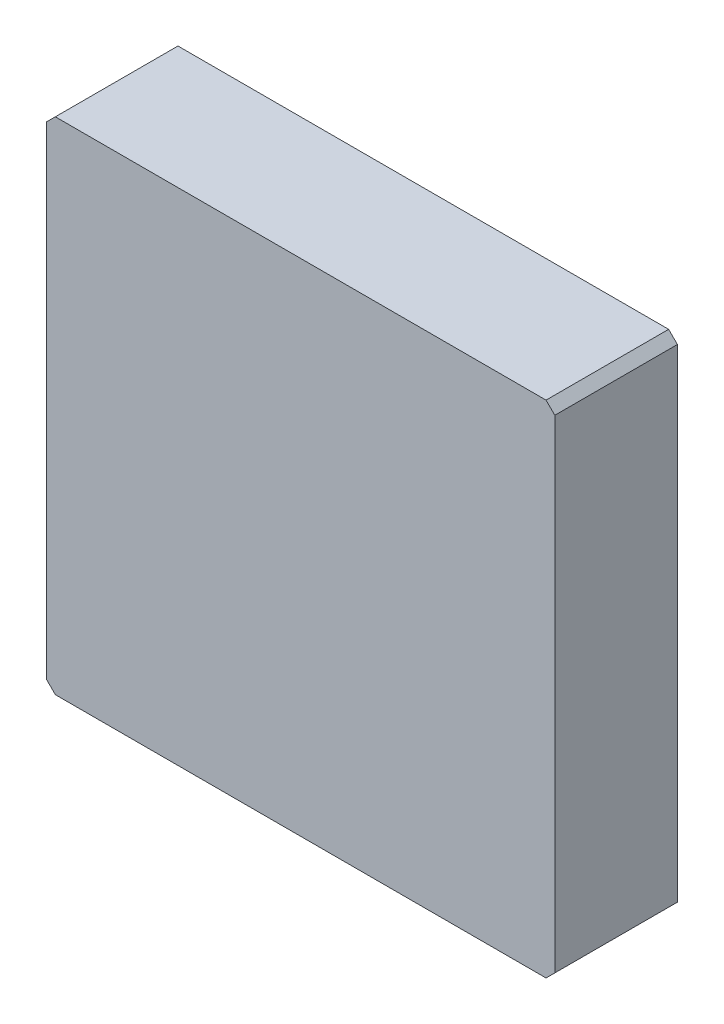
ISO-10303-21;
HEADER;
FILE_DESCRIPTION(('STEP AP214'),'2;1');
FILE_NAME('part.step','',(''),(''),'','','');
FILE_SCHEMA(('AUTOMOTIVE_DESIGN { 1 0 10303 214 1 1 1 1 }'));
ENDSEC;
DATA;
#1=APPLICATION_CONTEXT('core data for automotive mechanical design processes');
#2=APPLICATION_PROTOCOL_DEFINITION('international standard','automotive_design',2000,#1);
#3=PRODUCT_CONTEXT('',#1,'mechanical');
#4=PRODUCT('Part','Part','',(#3));
#5=PRODUCT_RELATED_PRODUCT_CATEGORY('part','',(#4));
#6=PRODUCT_DEFINITION_FORMATION('','',#4);
#7=PRODUCT_DEFINITION_CONTEXT('part definition',#1,'design');
#8=PRODUCT_DEFINITION('design','',#6,#7);
#9=PRODUCT_DEFINITION_SHAPE('','',#8);
#10=(LENGTH_UNIT() NAMED_UNIT(*) SI_UNIT(.MILLI.,.METRE.));
#11=(NAMED_UNIT(*) PLANE_ANGLE_UNIT() SI_UNIT($,.RADIAN.));
#12=(NAMED_UNIT(*) SI_UNIT($,.STERADIAN.) SOLID_ANGLE_UNIT());
#13=UNCERTAINTY_MEASURE_WITH_UNIT(LENGTH_MEASURE(1.E-05),#10,'distance_accuracy_value','');
#14=(GEOMETRIC_REPRESENTATION_CONTEXT(3) GLOBAL_UNCERTAINTY_ASSIGNED_CONTEXT((#13)) GLOBAL_UNIT_ASSIGNED_CONTEXT((#10,
#11,#12)) REPRESENTATION_CONTEXT('',''));
#15=CARTESIAN_POINT('',(0.,0.,0.));
#16=DIRECTION('',(0.,0.,1.));
#17=DIRECTION('',(1.,0.,0.));
#18=AXIS2_PLACEMENT_3D('',#15,#16,#17);
#19=CARTESIAN_POINT('',(0.,3.55599999999999,49.784));
#20=DIRECTION('',(1.,0.,0.));
#21=DIRECTION('',(0.,0.,-1.));
#22=AXIS2_PLACEMENT_3D('',#19,#20,#21);
#23=PLANE('',#22);
#24=DIRECTION('',(0.,-1.,0.));
#25=VECTOR('',#24,1.);
#26=CARTESIAN_POINT('',(0.,3.55599999999999,0.));
#27=LINE('',#26,#25);
#28=CARTESIAN_POINT('',(0.,199.644,0.));
#29=VERTEX_POINT('',#28);
#30=CARTESIAN_POINT('',(0.,3.55599999999999,0.));
#31=VERTEX_POINT('',#30);
#32=EDGE_CURVE('E141',#29,#31,#27,.T.);
#33=ORIENTED_EDGE('',*,*,#32,.T.);
#34=DIRECTION('',(0.,0.,-1.));
#35=VECTOR('',#34,1.);
#36=CARTESIAN_POINT('',(0.,3.55599999999999,49.784));
#37=LINE('',#36,#35);
#38=CARTESIAN_POINT('',(0.,3.55599999999999,49.784));
#39=VERTEX_POINT('',#38);
#40=EDGE_CURVE('E11',#39,#31,#37,.T.);
#41=ORIENTED_EDGE('',*,*,#40,.F.);
#42=DIRECTION('',(0.,-1.,0.));
#43=VECTOR('',#42,1.);
#44=CARTESIAN_POINT('',(0.,3.55599999999999,49.784));
#45=LINE('',#44,#43);
#46=CARTESIAN_POINT('',(0.,199.644,49.784));
#47=VERTEX_POINT('',#46);
#48=EDGE_CURVE('E157',#47,#39,#45,.T.);
#49=ORIENTED_EDGE('',*,*,#48,.F.);
#50=DIRECTION('',(0.,0.,-1.));
#51=VECTOR('',#50,1.);
#52=CARTESIAN_POINT('',(0.,199.644,49.784));
#53=LINE('',#52,#51);
#54=EDGE_CURVE('E137',#47,#29,#53,.T.);
#55=ORIENTED_EDGE('',*,*,#54,.T.);
#56=EDGE_LOOP('',(#33,#41,#49,#55));
#57=FACE_BOUND('',#56,.T.);
#58=ADVANCED_FACE('F33',(#57),#23,.F.);
#59=CARTESIAN_POINT('',(0.,3.55599999999999,49.784));
#60=DIRECTION('',(0.707106781186546,0.707106781186549,0.));
#61=DIRECTION('',(-0.707106781186549,0.707106781186546,0.));
#62=AXIS2_PLACEMENT_3D('',#59,#60,#61);
#63=PLANE('',#62);
#64=DIRECTION('',(0.707106781186549,-0.707106781186546,0.));
#65=VECTOR('',#64,1.);
#66=CARTESIAN_POINT('',(0.,3.55599999999999,0.));
#67=LINE('',#66,#65);
#68=CARTESIAN_POINT('',(3.556,0.,0.));
#69=VERTEX_POINT('',#68);
#70=EDGE_CURVE('E144',#31,#69,#67,.T.);
#71=ORIENTED_EDGE('',*,*,#70,.T.);
#72=DIRECTION('',(0.,0.,-1.));
#73=VECTOR('',#72,1.);
#74=CARTESIAN_POINT('',(3.556,0.,49.784));
#75=LINE('',#74,#73);
#76=CARTESIAN_POINT('',(3.556,0.,49.784));
#77=VERTEX_POINT('',#76);
#78=EDGE_CURVE('E40',#77,#69,#75,.T.);
#79=ORIENTED_EDGE('',*,*,#78,.F.);
#80=DIRECTION('',(0.707106781186549,-0.707106781186546,0.));
#81=VECTOR('',#80,1.);
#82=CARTESIAN_POINT('',(0.,3.55599999999999,49.784));
#83=LINE('',#82,#81);
#84=EDGE_CURVE('E97',#39,#77,#83,.T.);
#85=ORIENTED_EDGE('',*,*,#84,.F.);
#86=ORIENTED_EDGE('',*,*,#40,.T.);
#87=EDGE_LOOP('',(#71,#79,#85,#86));
#88=FACE_BOUND('',#87,.T.);
#89=ADVANCED_FACE('F403',(#88),#63,.F.);
#90=CARTESIAN_POINT('',(3.556,0.,49.784));
#91=DIRECTION('',(0.,1.,0.));
#92=DIRECTION('',(0.,0.,1.));
#93=AXIS2_PLACEMENT_3D('',#90,#91,#92);
#94=PLANE('',#93);
#95=DIRECTION('',(1.,0.,0.));
#96=VECTOR('',#95,1.);
#97=CARTESIAN_POINT('',(3.556,0.,0.));
#98=LINE('',#97,#96);
#99=CARTESIAN_POINT('',(202.7936,0.,0.));
#100=VERTEX_POINT('',#99);
#101=EDGE_CURVE('E147',#69,#100,#98,.T.);
#102=ORIENTED_EDGE('',*,*,#101,.T.);
#103=DIRECTION('',(0.,0.,-1.));
#104=VECTOR('',#103,1.);
#105=CARTESIAN_POINT('',(202.7936,0.,49.784));
#106=LINE('',#105,#104);
#107=CARTESIAN_POINT('',(202.7936,0.,49.784));
#108=VERTEX_POINT('',#107);
#109=EDGE_CURVE('E164',#108,#100,#106,.T.);
#110=ORIENTED_EDGE('',*,*,#109,.F.);
#111=DIRECTION('',(1.,0.,0.));
#112=VECTOR('',#111,1.);
#113=CARTESIAN_POINT('',(3.556,0.,49.784));
#114=LINE('',#113,#112);
#115=EDGE_CURVE('E172',#77,#108,#114,.T.);
#116=ORIENTED_EDGE('',*,*,#115,.F.);
#117=ORIENTED_EDGE('',*,*,#78,.T.);
#118=EDGE_LOOP('',(#102,#110,#116,#117));
#119=FACE_BOUND('',#118,.T.);
#120=ADVANCED_FACE('F170',(#119),#94,.F.);
#121=CARTESIAN_POINT('',(202.7936,0.,49.784));
#122=DIRECTION('',(-0.707106781186546,0.707106781186549,0.));
#123=DIRECTION('',(-0.707106781186549,-0.707106781186546,0.));
#124=AXIS2_PLACEMENT_3D('',#121,#122,#123);
#125=PLANE('',#124);
#126=DIRECTION('',(0.707106781186549,0.707106781186546,0.));
#127=VECTOR('',#126,1.);
#128=CARTESIAN_POINT('',(202.7936,0.,0.));
#129=LINE('',#128,#127);
#130=CARTESIAN_POINT('',(206.3496,3.55599999999999,0.));
#131=VERTEX_POINT('',#130);
#132=EDGE_CURVE('E149',#100,#131,#129,.T.);
#133=ORIENTED_EDGE('',*,*,#132,.T.);
#134=DIRECTION('',(0.,0.,-1.));
#135=VECTOR('',#134,1.);
#136=CARTESIAN_POINT('',(206.3496,3.55599999999999,49.784));
#137=LINE('',#136,#135);
#138=CARTESIAN_POINT('',(206.3496,3.55599999999999,49.784));
#139=VERTEX_POINT('',#138);
#140=EDGE_CURVE('E161',#139,#131,#137,.T.);
#141=ORIENTED_EDGE('',*,*,#140,.F.);
#142=DIRECTION('',(0.707106781186549,0.707106781186546,0.));
#143=VECTOR('',#142,1.);
#144=CARTESIAN_POINT('',(202.7936,0.,49.784));
#145=LINE('',#144,#143);
#146=EDGE_CURVE('E184',#108,#139,#145,.T.);
#147=ORIENTED_EDGE('',*,*,#146,.F.);
#148=ORIENTED_EDGE('',*,*,#109,.T.);
#149=EDGE_LOOP('',(#133,#141,#147,#148));
#150=FACE_BOUND('',#149,.T.);
#151=ADVANCED_FACE('F180',(#150),#125,.F.);
#152=CARTESIAN_POINT('',(206.3496,3.55599999999999,49.784));
#153=DIRECTION('',(-1.,0.,0.));
#154=DIRECTION('',(0.,0.,1.));
#155=AXIS2_PLACEMENT_3D('',#152,#153,#154);
#156=PLANE('',#155);
#157=DIRECTION('',(0.,1.,0.));
#158=VECTOR('',#157,1.);
#159=CARTESIAN_POINT('',(206.3496,3.55599999999999,0.));
#160=LINE('',#159,#158);
#161=CARTESIAN_POINT('',(206.3496,199.644,0.));
#162=VERTEX_POINT('',#161);
#163=EDGE_CURVE('E151',#131,#162,#160,.T.);
#164=ORIENTED_EDGE('',*,*,#163,.T.);
#165=DIRECTION('',(0.,0.,-1.));
#166=VECTOR('',#165,1.);
#167=CARTESIAN_POINT('',(206.3496,199.644,49.784));
#168=LINE('',#167,#166);
#169=CARTESIAN_POINT('',(206.3496,199.644,49.784));
#170=VERTEX_POINT('',#169);
#171=EDGE_CURVE('E132',#170,#162,#168,.T.);
#172=ORIENTED_EDGE('',*,*,#171,.F.);
#173=DIRECTION('',(0.,1.,0.));
#174=VECTOR('',#173,1.);
#175=CARTESIAN_POINT('',(206.3496,3.55599999999999,49.784));
#176=LINE('',#175,#174);
#177=EDGE_CURVE('E120',#139,#170,#176,.T.);
#178=ORIENTED_EDGE('',*,*,#177,.F.);
#179=ORIENTED_EDGE('',*,*,#140,.T.);
#180=EDGE_LOOP('',(#164,#172,#178,#179));
#181=FACE_BOUND('',#180,.T.);
#182=ADVANCED_FACE('F183',(#181),#156,.F.);
#183=CARTESIAN_POINT('',(202.7936,203.2,49.784));
#184=DIRECTION('',(-0.707106781186545,-0.70710678118655,0.));
#185=DIRECTION('',(0.70710678118655,-0.707106781186545,0.));
#186=AXIS2_PLACEMENT_3D('',#183,#184,#185);
#187=PLANE('',#186);
#188=DIRECTION('',(-0.70710678118655,0.707106781186545,0.));
#189=VECTOR('',#188,1.);
#190=CARTESIAN_POINT('',(202.7936,203.2,0.));
#191=LINE('',#190,#189);
#192=CARTESIAN_POINT('',(202.7936,203.2,0.));
#193=VERTEX_POINT('',#192);
#194=EDGE_CURVE('E129',#162,#193,#191,.T.);
#195=ORIENTED_EDGE('',*,*,#194,.T.);
#196=DIRECTION('',(0.,0.,-1.));
#197=VECTOR('',#196,1.);
#198=CARTESIAN_POINT('',(202.7936,203.2,49.784));
#199=LINE('',#198,#197);
#200=CARTESIAN_POINT('',(202.7936,203.2,49.784));
#201=VERTEX_POINT('',#200);
#202=EDGE_CURVE('E126',#201,#193,#199,.T.);
#203=ORIENTED_EDGE('',*,*,#202,.F.);
#204=DIRECTION('',(-0.70710678118655,0.707106781186545,0.));
#205=VECTOR('',#204,1.);
#206=CARTESIAN_POINT('',(202.7936,203.2,49.784));
#207=LINE('',#206,#205);
#208=EDGE_CURVE('E113',#170,#201,#207,.T.);
#209=ORIENTED_EDGE('',*,*,#208,.F.);
#210=ORIENTED_EDGE('',*,*,#171,.T.);
#211=EDGE_LOOP('',(#195,#203,#209,#210));
#212=FACE_BOUND('',#211,.T.);
#213=ADVANCED_FACE('F127',(#212),#187,.F.);
#214=CARTESIAN_POINT('',(3.55599999999999,203.2,49.784));
#215=DIRECTION('',(0.,-1.,0.));
#216=DIRECTION('',(0.,0.,-1.));
#217=AXIS2_PLACEMENT_3D('',#214,#215,#216);
#218=PLANE('',#217);
#219=DIRECTION('',(-1.,0.,0.));
#220=VECTOR('',#219,1.);
#221=CARTESIAN_POINT('',(3.55599999999999,203.2,0.));
#222=LINE('',#221,#220);
#223=CARTESIAN_POINT('',(3.55599999999999,203.2,0.));
#224=VERTEX_POINT('',#223);
#225=EDGE_CURVE('E154',#193,#224,#222,.T.);
#226=ORIENTED_EDGE('',*,*,#225,.T.);
#227=DIRECTION('',(0.,0.,-1.));
#228=VECTOR('',#227,1.);
#229=CARTESIAN_POINT('',(3.55599999999999,203.2,49.784));
#230=LINE('',#229,#228);
#231=CARTESIAN_POINT('',(3.55599999999999,203.2,49.784));
#232=VERTEX_POINT('',#231);
#233=EDGE_CURVE('E133',#232,#224,#230,.T.);
#234=ORIENTED_EDGE('',*,*,#233,.F.);
#235=DIRECTION('',(-1.,0.,0.));
#236=VECTOR('',#235,1.);
#237=CARTESIAN_POINT('',(3.55599999999999,203.2,49.784));
#238=LINE('',#237,#236);
#239=EDGE_CURVE('E117',#201,#232,#238,.T.);
#240=ORIENTED_EDGE('',*,*,#239,.F.);
#241=ORIENTED_EDGE('',*,*,#202,.T.);
#242=EDGE_LOOP('',(#226,#234,#240,#241));
#243=FACE_BOUND('',#242,.T.);
#244=ADVANCED_FACE('F135',(#243),#218,.F.);
#245=CARTESIAN_POINT('',(0.,199.644,49.784));
#246=DIRECTION('',(0.707106781186549,-0.707106781186546,0.));
#247=DIRECTION('',(0.707106781186546,0.707106781186549,0.));
#248=AXIS2_PLACEMENT_3D('',#245,#246,#247);
#249=PLANE('',#248);
#250=DIRECTION('',(-0.707106781186546,-0.707106781186549,0.));
#251=VECTOR('',#250,1.);
#252=CARTESIAN_POINT('',(0.,199.644,0.));
#253=LINE('',#252,#251);
#254=EDGE_CURVE('E89',#224,#29,#253,.T.);
#255=ORIENTED_EDGE('',*,*,#254,.T.);
#256=ORIENTED_EDGE('',*,*,#54,.F.);
#257=DIRECTION('',(-0.707106781186546,-0.707106781186549,0.));
#258=VECTOR('',#257,1.);
#259=CARTESIAN_POINT('',(0.,199.644,49.784));
#260=LINE('',#259,#258);
#261=EDGE_CURVE('E56',#232,#47,#260,.T.);
#262=ORIENTED_EDGE('',*,*,#261,.F.);
#263=ORIENTED_EDGE('',*,*,#233,.T.);
#264=EDGE_LOOP('',(#255,#256,#262,#263));
#265=FACE_BOUND('',#264,.T.);
#266=ADVANCED_FACE('F410',(#265),#249,.F.);
#267=CARTESIAN_POINT('',(0.,0.,49.784));
#268=DIRECTION('',(0.,0.,-1.));
#269=DIRECTION('',(-1.,0.,0.));
#270=AXIS2_PLACEMENT_3D('',#267,#268,#269);
#271=PLANE('',#270);
#272=ORIENTED_EDGE('',*,*,#48,.T.);
#273=ORIENTED_EDGE('',*,*,#84,.T.);
#274=ORIENTED_EDGE('',*,*,#115,.T.);
#275=ORIENTED_EDGE('',*,*,#146,.T.);
#276=ORIENTED_EDGE('',*,*,#177,.T.);
#277=ORIENTED_EDGE('',*,*,#208,.T.);
#278=ORIENTED_EDGE('',*,*,#239,.T.);
#279=ORIENTED_EDGE('',*,*,#261,.T.);
#280=EDGE_LOOP('',(#272,#273,#274,#275,#276,#277,#278,#279));
#281=FACE_BOUND('',#280,.T.);
#282=ADVANCED_FACE('F115',(#281),#271,.F.);
#283=CARTESIAN_POINT('',(0.,0.,0.));
#284=DIRECTION('',(0.,0.,-1.));
#285=DIRECTION('',(-1.,0.,0.));
#286=AXIS2_PLACEMENT_3D('',#283,#284,#285);
#287=PLANE('',#286);
#288=DIRECTION('',(-0.707106781186546,0.707106781186549,0.));
#289=VECTOR('',#288,1.);
#290=CARTESIAN_POINT('',(57.7596,100.076,0.));
#291=LINE('',#290,#289);
#292=CARTESIAN_POINT('',(57.7596,100.076,0.));
#293=VERTEX_POINT('',#292);
#294=CARTESIAN_POINT('',(54.2036,103.632,0.));
#295=VERTEX_POINT('',#294);
#296=EDGE_CURVE('E47',#293,#295,#291,.T.);
#297=ORIENTED_EDGE('',*,*,#296,.F.);
#298=DIRECTION('',(0.,1.,0.));
#299=VECTOR('',#298,1.);
#300=CARTESIAN_POINT('',(57.7596,21.3614000000001,0.));
#301=LINE('',#300,#299);
#302=CARTESIAN_POINT('',(57.7596,21.3614000000001,0.));
#303=VERTEX_POINT('',#302);
#304=EDGE_CURVE('E224',#303,#293,#301,.T.);
#305=ORIENTED_EDGE('',*,*,#304,.F.);
#306=CARTESIAN_POINT('',(65.913,21.3614,0.));
#307=DIRECTION('',(0.,0.,-1.));
#308=DIRECTION('',(-1.,0.,0.));
#309=AXIS2_PLACEMENT_3D('',#306,#307,#308);
#310=CIRCLE('',#309,8.1534);
#311=CARTESIAN_POINT('',(65.9130000000001,13.208,0.));
#312=VERTEX_POINT('',#311);
#313=EDGE_CURVE('E228',#312,#303,#310,.T.);
#314=ORIENTED_EDGE('',*,*,#313,.F.);
#315=DIRECTION('',(-1.,0.,0.));
#316=VECTOR('',#315,1.);
#317=CARTESIAN_POINT('',(184.7342,13.208,0.));
#318=LINE('',#317,#316);
#319=CARTESIAN_POINT('',(184.7342,13.208,0.));
#320=VERTEX_POINT('',#319);
#321=EDGE_CURVE('E231',#320,#312,#318,.T.);
#322=ORIENTED_EDGE('',*,*,#321,.F.);
#323=CARTESIAN_POINT('',(184.7342,21.3614,0.));
#324=DIRECTION('',(0.,0.,-1.));
#325=DIRECTION('',(-1.,0.,0.));
#326=AXIS2_PLACEMENT_3D('',#323,#324,#325);
#327=CIRCLE('',#326,8.1534);
#328=CARTESIAN_POINT('',(192.8876,21.3614000000001,0.));
#329=VERTEX_POINT('',#328);
#330=EDGE_CURVE('E234',#329,#320,#327,.T.);
#331=ORIENTED_EDGE('',*,*,#330,.F.);
#332=DIRECTION('',(0.,-1.,0.));
#333=VECTOR('',#332,1.);
#334=CARTESIAN_POINT('',(192.8876,181.8386,0.));
#335=LINE('',#334,#333);
#336=CARTESIAN_POINT('',(192.8876,181.8386,0.));
#337=VERTEX_POINT('',#336);
#338=EDGE_CURVE('E237',#337,#329,#335,.T.);
#339=ORIENTED_EDGE('',*,*,#338,.F.);
#340=CARTESIAN_POINT('',(184.7342,181.8386,0.));
#341=DIRECTION('',(0.,0.,-1.));
#342=DIRECTION('',(1.,0.,0.));
#343=AXIS2_PLACEMENT_3D('',#340,#341,#342);
#344=CIRCLE('',#343,8.1534);
#345=CARTESIAN_POINT('',(184.7342,189.992,0.));
#346=VERTEX_POINT('',#345);
#347=EDGE_CURVE('E240',#346,#337,#344,.T.);
#348=ORIENTED_EDGE('',*,*,#347,.F.);
#349=DIRECTION('',(1.,0.,0.));
#350=VECTOR('',#349,1.);
#351=CARTESIAN_POINT('',(21.3614000000001,189.992,0.));
#352=LINE('',#351,#350);
#353=CARTESIAN_POINT('',(21.3614000000001,189.992,0.));
#354=VERTEX_POINT('',#353);
#355=EDGE_CURVE('E243',#354,#346,#352,.T.);
#356=ORIENTED_EDGE('',*,*,#355,.F.);
#357=CARTESIAN_POINT('',(21.3614,181.8386,0.));
#358=DIRECTION('',(0.,0.,-1.));
#359=DIRECTION('',(-1.,0.,0.));
#360=AXIS2_PLACEMENT_3D('',#357,#358,#359);
#361=CIRCLE('',#360,8.1534);
#362=CARTESIAN_POINT('',(13.208,181.8386,0.));
#363=VERTEX_POINT('',#362);
#364=EDGE_CURVE('E246',#363,#354,#361,.T.);
#365=ORIENTED_EDGE('',*,*,#364,.F.);
#366=DIRECTION('',(0.,1.,0.));
#367=VECTOR('',#366,1.);
#368=CARTESIAN_POINT('',(13.208,111.7854,0.));
#369=LINE('',#368,#367);
#370=CARTESIAN_POINT('',(13.208,111.7854,0.));
#371=VERTEX_POINT('',#370);
#372=EDGE_CURVE('E249',#371,#363,#369,.T.);
#373=ORIENTED_EDGE('',*,*,#372,.F.);
#374=CARTESIAN_POINT('',(21.3614,111.7854,0.));
#375=DIRECTION('',(0.,0.,-1.));
#376=DIRECTION('',(-1.,0.,0.));
#377=AXIS2_PLACEMENT_3D('',#374,#375,#376);
#378=CIRCLE('',#377,8.1534);
#379=CARTESIAN_POINT('',(21.3614000000001,103.632,0.));
#380=VERTEX_POINT('',#379);
#381=EDGE_CURVE('E252',#380,#371,#378,.T.);
#382=ORIENTED_EDGE('',*,*,#381,.F.);
#383=DIRECTION('',(-1.,0.,0.));
#384=VECTOR('',#383,1.);
#385=CARTESIAN_POINT('',(54.2036,103.632,0.));
#386=LINE('',#385,#384);
#387=EDGE_CURVE('E255',#295,#380,#386,.T.);
#388=ORIENTED_EDGE('',*,*,#387,.F.);
#389=EDGE_LOOP('',(#297,#305,#314,#322,#331,#339,#348,#356,#365,#373,#382,#388));
#390=FACE_BOUND('',#389,.T.);
#391=ORIENTED_EDGE('',*,*,#32,.F.);
#392=ORIENTED_EDGE('',*,*,#254,.F.);
#393=ORIENTED_EDGE('',*,*,#225,.F.);
#394=ORIENTED_EDGE('',*,*,#194,.F.);
#395=ORIENTED_EDGE('',*,*,#163,.F.);
#396=ORIENTED_EDGE('',*,*,#132,.F.);
#397=ORIENTED_EDGE('',*,*,#101,.F.);
#398=ORIENTED_EDGE('',*,*,#70,.F.);
#399=EDGE_LOOP('',(#391,#392,#393,#394,#395,#396,#397,#398));
#400=FACE_BOUND('',#399,.T.);
#401=ADVANCED_FACE('F176',(#390,#400),#287,.T.);
#402=CARTESIAN_POINT('',(57.7596,100.076,31.877));
#403=DIRECTION('',(-0.707106781186549,-0.707106781186546,0.));
#404=DIRECTION('',(0.707106781186546,-0.707106781186549,0.));
#405=AXIS2_PLACEMENT_3D('',#402,#403,#404);
#406=PLANE('',#405);
#407=ORIENTED_EDGE('',*,*,#296,.T.);
#408=DIRECTION('',(0.,0.,-1.));
#409=VECTOR('',#408,1.);
#410=CARTESIAN_POINT('',(54.2036,103.632,31.877));
#411=LINE('',#410,#409);
#412=CARTESIAN_POINT('',(54.2036,103.632,31.877));
#413=VERTEX_POINT('',#412);
#414=EDGE_CURVE('E190',#413,#295,#411,.T.);
#415=ORIENTED_EDGE('',*,*,#414,.F.);
#416=DIRECTION('',(-0.707106781186546,0.707106781186549,0.));
#417=VECTOR('',#416,1.);
#418=CARTESIAN_POINT('',(57.7596,100.076,31.877));
#419=LINE('',#418,#417);
#420=CARTESIAN_POINT('',(57.7596,100.076,31.877));
#421=VERTEX_POINT('',#420);
#422=EDGE_CURVE('E227',#421,#413,#419,.T.);
#423=ORIENTED_EDGE('',*,*,#422,.F.);
#424=DIRECTION('',(0.,0.,-1.));
#425=VECTOR('',#424,1.);
#426=CARTESIAN_POINT('',(57.7596,100.076,31.877));
#427=LINE('',#426,#425);
#428=EDGE_CURVE('E145',#421,#293,#427,.T.);
#429=ORIENTED_EDGE('',*,*,#428,.T.);
#430=EDGE_LOOP('',(#407,#415,#423,#429));
#431=FACE_BOUND('',#430,.T.);
#432=ADVANCED_FACE('F300',(#431),#406,.F.);
#433=CARTESIAN_POINT('',(57.7596,21.3614000000001,31.877));
#434=DIRECTION('',(-1.,0.,0.));
#435=DIRECTION('',(0.,-1.,0.));
#436=AXIS2_PLACEMENT_3D('',#433,#434,#435);
#437=PLANE('',#436);
#438=ORIENTED_EDGE('',*,*,#304,.T.);
#439=ORIENTED_EDGE('',*,*,#428,.F.);
#440=DIRECTION('',(0.,1.,0.));
#441=VECTOR('',#440,1.);
#442=CARTESIAN_POINT('',(57.7596,21.3614000000001,31.877));
#443=LINE('',#442,#441);
#444=CARTESIAN_POINT('',(57.7596,21.3614000000001,31.877));
#445=VERTEX_POINT('',#444);
#446=EDGE_CURVE('E193',#445,#421,#443,.T.);
#447=ORIENTED_EDGE('',*,*,#446,.F.);
#448=DIRECTION('',(0.,0.,-1.));
#449=VECTOR('',#448,1.);
#450=CARTESIAN_POINT('',(57.7596,21.3614000000001,31.877));
#451=LINE('',#450,#449);
#452=EDGE_CURVE('E220',#445,#303,#451,.T.);
#453=ORIENTED_EDGE('',*,*,#452,.T.);
#454=EDGE_LOOP('',(#438,#439,#447,#453));
#455=FACE_BOUND('',#454,.T.);
#456=ADVANCED_FACE('F328',(#455),#437,.F.);
#457=CARTESIAN_POINT('',(65.913,21.3614,31.877));
#458=DIRECTION('',(0.,0.,-1.));
#459=DIRECTION('',(-1.,0.,0.));
#460=AXIS2_PLACEMENT_3D('',#457,#458,#459);
#461=CYLINDRICAL_SURFACE('',#460,8.1534);
#462=ORIENTED_EDGE('',*,*,#313,.T.);
#463=ORIENTED_EDGE('',*,*,#452,.F.);
#464=CARTESIAN_POINT('',(65.913,21.3614,31.877));
#465=DIRECTION('',(0.,0.,-1.));
#466=DIRECTION('',(-1.,0.,0.));
#467=AXIS2_PLACEMENT_3D('',#464,#465,#466);
#468=CIRCLE('',#467,8.1534);
#469=CARTESIAN_POINT('',(65.9130000000001,13.208,31.877));
#470=VERTEX_POINT('',#469);
#471=EDGE_CURVE('E261',#470,#445,#468,.T.);
#472=ORIENTED_EDGE('',*,*,#471,.F.);
#473=DIRECTION('',(0.,0.,-1.));
#474=VECTOR('',#473,1.);
#475=CARTESIAN_POINT('',(65.9130000000001,13.208,31.877));
#476=LINE('',#475,#474);
#477=EDGE_CURVE('E217',#470,#312,#476,.T.);
#478=ORIENTED_EDGE('',*,*,#477,.T.);
#479=EDGE_LOOP('',(#462,#463,#472,#478));
#480=FACE_BOUND('',#479,.T.);
#481=ADVANCED_FACE('F333',(#480),#461,.F.);
#482=CARTESIAN_POINT('',(184.7342,13.208,31.877));
#483=DIRECTION('',(0.,-1.,0.));
#484=DIRECTION('',(0.,0.,-1.));
#485=AXIS2_PLACEMENT_3D('',#482,#483,#484);
#486=PLANE('',#485);
#487=ORIENTED_EDGE('',*,*,#321,.T.);
#488=ORIENTED_EDGE('',*,*,#477,.F.);
#489=DIRECTION('',(-1.,0.,0.));
#490=VECTOR('',#489,1.);
#491=CARTESIAN_POINT('',(184.7342,13.208,31.877));
#492=LINE('',#491,#490);
#493=CARTESIAN_POINT('',(184.7342,13.208,31.877));
#494=VERTEX_POINT('',#493);
#495=EDGE_CURVE('E264',#494,#470,#492,.T.);
#496=ORIENTED_EDGE('',*,*,#495,.F.);
#497=DIRECTION('',(0.,0.,-1.));
#498=VECTOR('',#497,1.);
#499=CARTESIAN_POINT('',(184.7342,13.208,31.877));
#500=LINE('',#499,#498);
#501=EDGE_CURVE('E214',#494,#320,#500,.T.);
#502=ORIENTED_EDGE('',*,*,#501,.T.);
#503=EDGE_LOOP('',(#487,#488,#496,#502));
#504=FACE_BOUND('',#503,.T.);
#505=ADVANCED_FACE('F371',(#504),#486,.F.);
#506=CARTESIAN_POINT('',(184.7342,21.3614,31.877));
#507=DIRECTION('',(0.,0.,-1.));
#508=DIRECTION('',(-1.,0.,0.));
#509=AXIS2_PLACEMENT_3D('',#506,#507,#508);
#510=CYLINDRICAL_SURFACE('',#509,8.1534);
#511=ORIENTED_EDGE('',*,*,#330,.T.);
#512=ORIENTED_EDGE('',*,*,#501,.F.);
#513=CARTESIAN_POINT('',(184.7342,21.3614,31.877));
#514=DIRECTION('',(0.,0.,-1.));
#515=DIRECTION('',(-1.,0.,0.));
#516=AXIS2_PLACEMENT_3D('',#513,#514,#515);
#517=CIRCLE('',#516,8.1534);
#518=CARTESIAN_POINT('',(192.8876,21.3614000000001,31.877));
#519=VERTEX_POINT('',#518);
#520=EDGE_CURVE('E267',#519,#494,#517,.T.);
#521=ORIENTED_EDGE('',*,*,#520,.F.);
#522=DIRECTION('',(0.,0.,-1.));
#523=VECTOR('',#522,1.);
#524=CARTESIAN_POINT('',(192.8876,21.3614000000001,31.877));
#525=LINE('',#524,#523);
#526=EDGE_CURVE('E211',#519,#329,#525,.T.);
#527=ORIENTED_EDGE('',*,*,#526,.T.);
#528=EDGE_LOOP('',(#511,#512,#521,#527));
#529=FACE_BOUND('',#528,.T.);
#530=ADVANCED_FACE('F375',(#529),#510,.F.);
#531=CARTESIAN_POINT('',(192.8876,181.8386,31.877));
#532=DIRECTION('',(1.,0.,0.));
#533=DIRECTION('',(0.,1.,0.));
#534=AXIS2_PLACEMENT_3D('',#531,#532,#533);
#535=PLANE('',#534);
#536=ORIENTED_EDGE('',*,*,#338,.T.);
#537=ORIENTED_EDGE('',*,*,#526,.F.);
#538=DIRECTION('',(0.,-1.,0.));
#539=VECTOR('',#538,1.);
#540=CARTESIAN_POINT('',(192.8876,181.8386,31.877));
#541=LINE('',#540,#539);
#542=CARTESIAN_POINT('',(192.8876,181.8386,31.877));
#543=VERTEX_POINT('',#542);
#544=EDGE_CURVE('E270',#543,#519,#541,.T.);
#545=ORIENTED_EDGE('',*,*,#544,.F.);
#546=DIRECTION('',(0.,0.,-1.));
#547=VECTOR('',#546,1.);
#548=CARTESIAN_POINT('',(192.8876,181.8386,31.877));
#549=LINE('',#548,#547);
#550=EDGE_CURVE('E208',#543,#337,#549,.T.);
#551=ORIENTED_EDGE('',*,*,#550,.T.);
#552=EDGE_LOOP('',(#536,#537,#545,#551));
#553=FACE_BOUND('',#552,.T.);
#554=ADVANCED_FACE('F381',(#553),#535,.F.);
#555=CARTESIAN_POINT('',(184.7342,181.8386,31.877));
#556=DIRECTION('',(0.,0.,-1.));
#557=DIRECTION('',(-1.,0.,0.));
#558=AXIS2_PLACEMENT_3D('',#555,#556,#557);
#559=CYLINDRICAL_SURFACE('',#558,8.1534);
#560=ORIENTED_EDGE('',*,*,#347,.T.);
#561=ORIENTED_EDGE('',*,*,#550,.F.);
#562=CARTESIAN_POINT('',(184.7342,181.8386,31.877));
#563=DIRECTION('',(0.,0.,-1.));
#564=DIRECTION('',(1.,0.,0.));
#565=AXIS2_PLACEMENT_3D('',#562,#563,#564);
#566=CIRCLE('',#565,8.1534);
#567=CARTESIAN_POINT('',(184.7342,189.992,31.877));
#568=VERTEX_POINT('',#567);
#569=EDGE_CURVE('E273',#568,#543,#566,.T.);
#570=ORIENTED_EDGE('',*,*,#569,.F.);
#571=DIRECTION('',(0.,0.,-1.));
#572=VECTOR('',#571,1.);
#573=CARTESIAN_POINT('',(184.7342,189.992,31.877));
#574=LINE('',#573,#572);
#575=EDGE_CURVE('E205',#568,#346,#574,.T.);
#576=ORIENTED_EDGE('',*,*,#575,.T.);
#577=EDGE_LOOP('',(#560,#561,#570,#576));
#578=FACE_BOUND('',#577,.T.);
#579=ADVANCED_FACE('F384',(#578),#559,.F.);
#580=CARTESIAN_POINT('',(21.3614000000001,189.992,31.877));
#581=DIRECTION('',(0.,1.,0.));
#582=DIRECTION('',(-1.,0.,0.));
#583=AXIS2_PLACEMENT_3D('',#580,#581,#582);
#584=PLANE('',#583);
#585=ORIENTED_EDGE('',*,*,#355,.T.);
#586=ORIENTED_EDGE('',*,*,#575,.F.);
#587=DIRECTION('',(1.,0.,0.));
#588=VECTOR('',#587,1.);
#589=CARTESIAN_POINT('',(21.3614000000001,189.992,31.877));
#590=LINE('',#589,#588);
#591=CARTESIAN_POINT('',(21.3614000000001,189.992,31.877));
#592=VERTEX_POINT('',#591);
#593=EDGE_CURVE('E276',#592,#568,#590,.T.);
#594=ORIENTED_EDGE('',*,*,#593,.F.);
#595=DIRECTION('',(0.,0.,-1.));
#596=VECTOR('',#595,1.);
#597=CARTESIAN_POINT('',(21.3614000000001,189.992,31.877));
#598=LINE('',#597,#596);
#599=EDGE_CURVE('E202',#592,#354,#598,.T.);
#600=ORIENTED_EDGE('',*,*,#599,.T.);
#601=EDGE_LOOP('',(#585,#586,#594,#600));
#602=FACE_BOUND('',#601,.T.);
#603=ADVANCED_FACE('F387',(#602),#584,.F.);
#604=CARTESIAN_POINT('',(21.3614,181.8386,31.877));
#605=DIRECTION('',(0.,0.,-1.));
#606=DIRECTION('',(-1.,0.,0.));
#607=AXIS2_PLACEMENT_3D('',#604,#605,#606);
#608=CYLINDRICAL_SURFACE('',#607,8.1534);
#609=ORIENTED_EDGE('',*,*,#364,.T.);
#610=ORIENTED_EDGE('',*,*,#599,.F.);
#611=CARTESIAN_POINT('',(21.3614,181.8386,31.877));
#612=DIRECTION('',(0.,0.,-1.));
#613=DIRECTION('',(-1.,0.,0.));
#614=AXIS2_PLACEMENT_3D('',#611,#612,#613);
#615=CIRCLE('',#614,8.1534);
#616=CARTESIAN_POINT('',(13.208,181.8386,31.877));
#617=VERTEX_POINT('',#616);
#618=EDGE_CURVE('E279',#617,#592,#615,.T.);
#619=ORIENTED_EDGE('',*,*,#618,.F.);
#620=DIRECTION('',(0.,0.,-1.));
#621=VECTOR('',#620,1.);
#622=CARTESIAN_POINT('',(13.208,181.8386,31.877));
#623=LINE('',#622,#621);
#624=EDGE_CURVE('E199',#617,#363,#623,.T.);
#625=ORIENTED_EDGE('',*,*,#624,.T.);
#626=EDGE_LOOP('',(#609,#610,#619,#625));
#627=FACE_BOUND('',#626,.T.);
#628=ADVANCED_FACE('F390',(#627),#608,.F.);
#629=CARTESIAN_POINT('',(13.208,111.7854,31.877));
#630=DIRECTION('',(-1.,0.,0.));
#631=DIRECTION('',(0.,-1.,0.));
#632=AXIS2_PLACEMENT_3D('',#629,#630,#631);
#633=PLANE('',#632);
#634=ORIENTED_EDGE('',*,*,#372,.T.);
#635=ORIENTED_EDGE('',*,*,#624,.F.);
#636=DIRECTION('',(0.,1.,0.));
#637=VECTOR('',#636,1.);
#638=CARTESIAN_POINT('',(13.208,111.7854,31.877));
#639=LINE('',#638,#637);
#640=CARTESIAN_POINT('',(13.208,111.7854,31.877));
#641=VERTEX_POINT('',#640);
#642=EDGE_CURVE('E282',#641,#617,#639,.T.);
#643=ORIENTED_EDGE('',*,*,#642,.F.);
#644=DIRECTION('',(0.,0.,-1.));
#645=VECTOR('',#644,1.);
#646=CARTESIAN_POINT('',(13.208,111.7854,31.877));
#647=LINE('',#646,#645);
#648=EDGE_CURVE('E196',#641,#371,#647,.T.);
#649=ORIENTED_EDGE('',*,*,#648,.T.);
#650=EDGE_LOOP('',(#634,#635,#643,#649));
#651=FACE_BOUND('',#650,.T.);
#652=ADVANCED_FACE('F393',(#651),#633,.F.);
#653=CARTESIAN_POINT('',(21.3614,111.7854,31.877));
#654=DIRECTION('',(0.,0.,-1.));
#655=DIRECTION('',(-1.,0.,0.));
#656=AXIS2_PLACEMENT_3D('',#653,#654,#655);
#657=CYLINDRICAL_SURFACE('',#656,8.1534);
#658=ORIENTED_EDGE('',*,*,#381,.T.);
#659=ORIENTED_EDGE('',*,*,#648,.F.);
#660=CARTESIAN_POINT('',(21.3614,111.7854,31.877));
#661=DIRECTION('',(0.,0.,-1.));
#662=DIRECTION('',(-1.,0.,0.));
#663=AXIS2_PLACEMENT_3D('',#660,#661,#662);
#664=CIRCLE('',#663,8.1534);
#665=CARTESIAN_POINT('',(21.3614000000001,103.632,31.877));
#666=VERTEX_POINT('',#665);
#667=EDGE_CURVE('E285',#666,#641,#664,.T.);
#668=ORIENTED_EDGE('',*,*,#667,.F.);
#669=DIRECTION('',(0.,0.,-1.));
#670=VECTOR('',#669,1.);
#671=CARTESIAN_POINT('',(21.3614000000001,103.632,31.877));
#672=LINE('',#671,#670);
#673=EDGE_CURVE('E192',#666,#380,#672,.T.);
#674=ORIENTED_EDGE('',*,*,#673,.T.);
#675=EDGE_LOOP('',(#658,#659,#668,#674));
#676=FACE_BOUND('',#675,.T.);
#677=ADVANCED_FACE('F348',(#676),#657,.F.);
#678=CARTESIAN_POINT('',(54.2036,103.632,31.877));
#679=DIRECTION('',(0.,-1.,0.));
#680=DIRECTION('',(0.,0.,-1.));
#681=AXIS2_PLACEMENT_3D('',#678,#679,#680);
#682=PLANE('',#681);
#683=ORIENTED_EDGE('',*,*,#387,.T.);
#684=ORIENTED_EDGE('',*,*,#673,.F.);
#685=DIRECTION('',(-1.,0.,0.));
#686=VECTOR('',#685,1.);
#687=CARTESIAN_POINT('',(54.2036,103.632,31.877));
#688=LINE('',#687,#686);
#689=EDGE_CURVE('E288',#413,#666,#688,.T.);
#690=ORIENTED_EDGE('',*,*,#689,.F.);
#691=ORIENTED_EDGE('',*,*,#414,.T.);
#692=EDGE_LOOP('',(#683,#684,#690,#691));
#693=FACE_BOUND('',#692,.T.);
#694=ADVANCED_FACE('F342',(#693),#682,.F.);
#695=CARTESIAN_POINT('',(21.3614,111.7854,31.877));
#696=DIRECTION('',(0.,0.,-1.));
#697=DIRECTION('',(-1.,0.,0.));
#698=AXIS2_PLACEMENT_3D('',#695,#696,#697);
#699=PLANE('',#698);
#700=ORIENTED_EDGE('',*,*,#422,.T.);
#701=ORIENTED_EDGE('',*,*,#689,.T.);
#702=ORIENTED_EDGE('',*,*,#667,.T.);
#703=ORIENTED_EDGE('',*,*,#642,.T.);
#704=ORIENTED_EDGE('',*,*,#618,.T.);
#705=ORIENTED_EDGE('',*,*,#593,.T.);
#706=ORIENTED_EDGE('',*,*,#569,.T.);
#707=ORIENTED_EDGE('',*,*,#544,.T.);
#708=ORIENTED_EDGE('',*,*,#520,.T.);
#709=ORIENTED_EDGE('',*,*,#495,.T.);
#710=ORIENTED_EDGE('',*,*,#471,.T.);
#711=ORIENTED_EDGE('',*,*,#446,.T.);
#712=EDGE_LOOP('',(#700,#701,#702,#703,#704,#705,#706,#707,#708,#709,#710,#711));
#713=FACE_BOUND('',#712,.T.);
#714=ADVANCED_FACE('F295',(#713),#699,.T.);
#715=CLOSED_SHELL('',(#58,#89,#120,#151,#182,#213,#244,#266,#282,#401,#432,#456,#481,#505,#530,
#554,#579,#603,#628,#652,#677,#694,#714));
#716=MANIFOLD_SOLID_BREP('B2',#715);
#717=ADVANCED_BREP_SHAPE_REPRESENTATION('',(#18,#716),#14);
#718=SHAPE_DEFINITION_REPRESENTATION(#9,#717);
ENDSEC;
END-ISO-10303-21;
